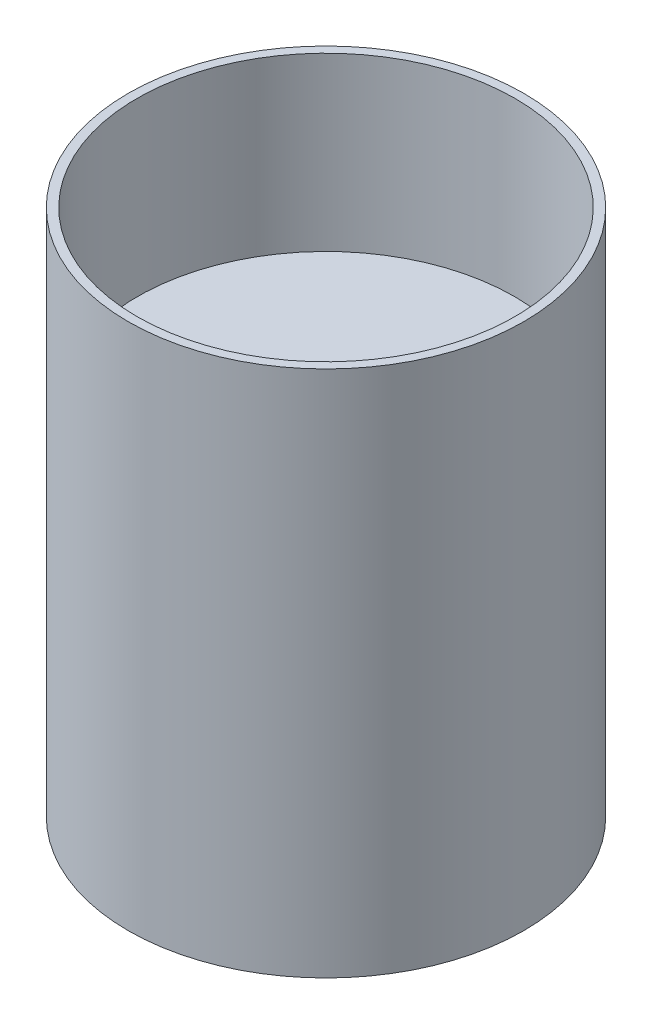
ISO-10303-21;
HEADER;
FILE_DESCRIPTION(('STEP AP214'),'2;1');
FILE_NAME('part.step','',(''),(''),'','','');
FILE_SCHEMA(('AUTOMOTIVE_DESIGN { 1 0 10303 214 1 1 1 1 }'));
ENDSEC;
DATA;
#1=APPLICATION_CONTEXT('core data for automotive mechanical design processes');
#2=APPLICATION_PROTOCOL_DEFINITION('international standard','automotive_design',2000,#1);
#3=PRODUCT_CONTEXT('',#1,'mechanical');
#4=PRODUCT('Part','Part','',(#3));
#5=PRODUCT_RELATED_PRODUCT_CATEGORY('part','',(#4));
#6=PRODUCT_DEFINITION_FORMATION('','',#4);
#7=PRODUCT_DEFINITION_CONTEXT('part definition',#1,'design');
#8=PRODUCT_DEFINITION('design','',#6,#7);
#9=PRODUCT_DEFINITION_SHAPE('','',#8);
#10=(LENGTH_UNIT() NAMED_UNIT(*) SI_UNIT(.MILLI.,.METRE.));
#11=(NAMED_UNIT(*) PLANE_ANGLE_UNIT() SI_UNIT($,.RADIAN.));
#12=(NAMED_UNIT(*) SI_UNIT($,.STERADIAN.) SOLID_ANGLE_UNIT());
#13=UNCERTAINTY_MEASURE_WITH_UNIT(LENGTH_MEASURE(1.E-05),#10,'distance_accuracy_value','');
#14=(GEOMETRIC_REPRESENTATION_CONTEXT(3) GLOBAL_UNCERTAINTY_ASSIGNED_CONTEXT((#13)) GLOBAL_UNIT_ASSIGNED_CONTEXT((#10,
#11,#12)) REPRESENTATION_CONTEXT('',''));
#15=CARTESIAN_POINT('',(0.,0.,0.));
#16=DIRECTION('',(0.,0.,1.));
#17=DIRECTION('',(1.,0.,0.));
#18=AXIS2_PLACEMENT_3D('',#15,#16,#17);
#19=CARTESIAN_POINT('',(0.,81.,0.));
#20=DIRECTION('',(0.,-1.,0.));
#21=DIRECTION('',(0.,0.,-1.));
#22=AXIS2_PLACEMENT_3D('',#19,#20,#21);
#23=CYLINDRICAL_SURFACE('',#22,42.9);
#24=CARTESIAN_POINT('',(0.,81.,0.));
#25=DIRECTION('',(0.,1.,0.));
#26=DIRECTION('',(0.,0.,1.));
#27=AXIS2_PLACEMENT_3D('',#24,#25,#26);
#28=CIRCLE('',#27,42.9);
#29=CARTESIAN_POINT('',(0.,81.,42.9));
#30=VERTEX_POINT('',#29);
#31=EDGE_CURVE('E11',#30,#30,#28,.T.);
#32=ORIENTED_EDGE('',*,*,#31,.F.);
#33=EDGE_LOOP('',(#32));
#34=FACE_BOUND('',#33,.T.);
#35=CARTESIAN_POINT('',(0.,3.,0.));
#36=DIRECTION('',(0.,1.,0.));
#37=DIRECTION('',(0.,0.,1.));
#38=AXIS2_PLACEMENT_3D('',#35,#36,#37);
#39=CIRCLE('',#38,42.9);
#40=CARTESIAN_POINT('',(0.,3.,42.9));
#41=VERTEX_POINT('',#40);
#42=EDGE_CURVE('E59',#41,#41,#39,.T.);
#43=ORIENTED_EDGE('',*,*,#42,.T.);
#44=EDGE_LOOP('',(#43));
#45=FACE_BOUND('',#44,.T.);
#46=ADVANCED_FACE('F54',(#34,#45),#23,.T.);
#47=CARTESIAN_POINT('',(0.,81.,0.));
#48=DIRECTION('',(0.,1.,0.));
#49=DIRECTION('',(0.,0.,1.));
#50=AXIS2_PLACEMENT_3D('',#47,#48,#49);
#51=PLANE('',#50);
#52=ORIENTED_EDGE('',*,*,#31,.T.);
#53=EDGE_LOOP('',(#52));
#54=FACE_BOUND('',#53,.T.);
#55=ADVANCED_FACE('F75',(#54),#51,.T.);
#56=CARTESIAN_POINT('',(0.,3.,0.));
#57=DIRECTION('',(0.,1.,0.));
#58=DIRECTION('',(0.,0.,1.));
#59=AXIS2_PLACEMENT_3D('',#56,#57,#58);
#60=PLANE('',#59);
#61=ORIENTED_EDGE('',*,*,#42,.F.);
#62=EDGE_LOOP('',(#61));
#63=FACE_BOUND('',#62,.T.);
#64=ADVANCED_FACE('F69',(#63),#60,.F.);
#65=CLOSED_SHELL('',(#46,#55,#64));
#66=MANIFOLD_SOLID_BREP('B2',#65);
#67=CARTESIAN_POINT('',(0.,120.,0.));
#68=DIRECTION('',(0.,-1.,0.));
#69=DIRECTION('',(0.,0.,-1.));
#70=AXIS2_PLACEMENT_3D('',#67,#68,#69);
#71=CYLINDRICAL_SURFACE('',#70,45.);
#72=CARTESIAN_POINT('',(0.,120.,0.));
#73=DIRECTION('',(0.,1.,0.));
#74=DIRECTION('',(0.,0.,1.));
#75=AXIS2_PLACEMENT_3D('',#72,#73,#74);
#76=CIRCLE('',#75,45.);
#77=CARTESIAN_POINT('',(0.,120.,45.));
#78=VERTEX_POINT('',#77);
#79=EDGE_CURVE('E53',#78,#78,#76,.T.);
#80=ORIENTED_EDGE('',*,*,#79,.F.);
#81=EDGE_LOOP('',(#80));
#82=FACE_BOUND('',#81,.T.);
#83=CARTESIAN_POINT('',(0.,0.,0.));
#84=DIRECTION('',(0.,1.,0.));
#85=DIRECTION('',(0.,0.,1.));
#86=AXIS2_PLACEMENT_3D('',#83,#84,#85);
#87=CIRCLE('',#86,45.);
#88=CARTESIAN_POINT('',(0.,0.,45.));
#89=VERTEX_POINT('',#88);
#90=EDGE_CURVE('E120',#89,#89,#87,.T.);
#91=ORIENTED_EDGE('',*,*,#90,.T.);
#92=EDGE_LOOP('',(#91));
#93=FACE_BOUND('',#92,.T.);
#94=ADVANCED_FACE('F109',(#82,#93),#71,.T.);
#95=CARTESIAN_POINT('',(0.,120.,0.));
#96=DIRECTION('',(0.,1.,0.));
#97=DIRECTION('',(0.,0.,1.));
#98=AXIS2_PLACEMENT_3D('',#95,#96,#97);
#99=PLANE('',#98);
#100=CARTESIAN_POINT('',(0.,120.,0.));
#101=DIRECTION('',(0.,1.,0.));
#102=DIRECTION('',(0.,0.,1.));
#103=AXIS2_PLACEMENT_3D('',#100,#101,#102);
#104=CIRCLE('',#103,43.);
#105=CARTESIAN_POINT('',(0.,120.,43.));
#106=VERTEX_POINT('',#105);
#107=EDGE_CURVE('E114',#106,#106,#104,.F.);
#108=ORIENTED_EDGE('',*,*,#107,.T.);
#109=EDGE_LOOP('',(#108));
#110=FACE_BOUND('',#109,.T.);
#111=ORIENTED_EDGE('',*,*,#79,.T.);
#112=EDGE_LOOP('',(#111));
#113=FACE_BOUND('',#112,.T.);
#114=ADVANCED_FACE('F128',(#110,#113),#99,.T.);
#115=CARTESIAN_POINT('',(0.,0.,0.));
#116=DIRECTION('',(0.,1.,0.));
#117=DIRECTION('',(0.,0.,1.));
#118=AXIS2_PLACEMENT_3D('',#115,#116,#117);
#119=PLANE('',#118);
#120=ORIENTED_EDGE('',*,*,#90,.F.);
#121=EDGE_LOOP('',(#120));
#122=FACE_BOUND('',#121,.T.);
#123=ADVANCED_FACE('F136',(#122),#119,.F.);
#124=CARTESIAN_POINT('',(0.,123.,0.));
#125=DIRECTION('',(0.,-1.,0.));
#126=DIRECTION('',(0.,0.,-1.));
#127=AXIS2_PLACEMENT_3D('',#124,#125,#126);
#128=CYLINDRICAL_SURFACE('',#127,43.);
#129=ORIENTED_EDGE('',*,*,#107,.F.);
#130=EDGE_LOOP('',(#129));
#131=FACE_BOUND('',#130,.T.);
#132=CARTESIAN_POINT('',(0.,3.,0.));
#133=DIRECTION('',(0.,1.,0.));
#134=DIRECTION('',(0.,0.,1.));
#135=AXIS2_PLACEMENT_3D('',#132,#133,#134);
#136=CIRCLE('',#135,43.);
#137=CARTESIAN_POINT('',(0.,3.,43.));
#138=VERTEX_POINT('',#137);
#139=EDGE_CURVE('E122',#138,#138,#136,.T.);
#140=ORIENTED_EDGE('',*,*,#139,.F.);
#141=EDGE_LOOP('',(#140));
#142=FACE_BOUND('',#141,.T.);
#143=ADVANCED_FACE('F135',(#131,#142),#128,.F.);
#144=CARTESIAN_POINT('',(0.,3.,0.));
#145=DIRECTION('',(0.,1.,0.));
#146=DIRECTION('',(0.,0.,1.));
#147=AXIS2_PLACEMENT_3D('',#144,#145,#146);
#148=PLANE('',#147);
#149=ORIENTED_EDGE('',*,*,#139,.T.);
#150=EDGE_LOOP('',(#149));
#151=FACE_BOUND('',#150,.T.);
#152=ADVANCED_FACE('F134',(#151),#148,.T.);
#153=CLOSED_SHELL('',(#94,#114,#123,#143,#152));
#154=MANIFOLD_SOLID_BREP('B6',#153);
#155=ADVANCED_BREP_SHAPE_REPRESENTATION('',(#18,#66,#154),#14);
#156=SHAPE_DEFINITION_REPRESENTATION(#9,#155);
ENDSEC;
END-ISO-10303-21;
